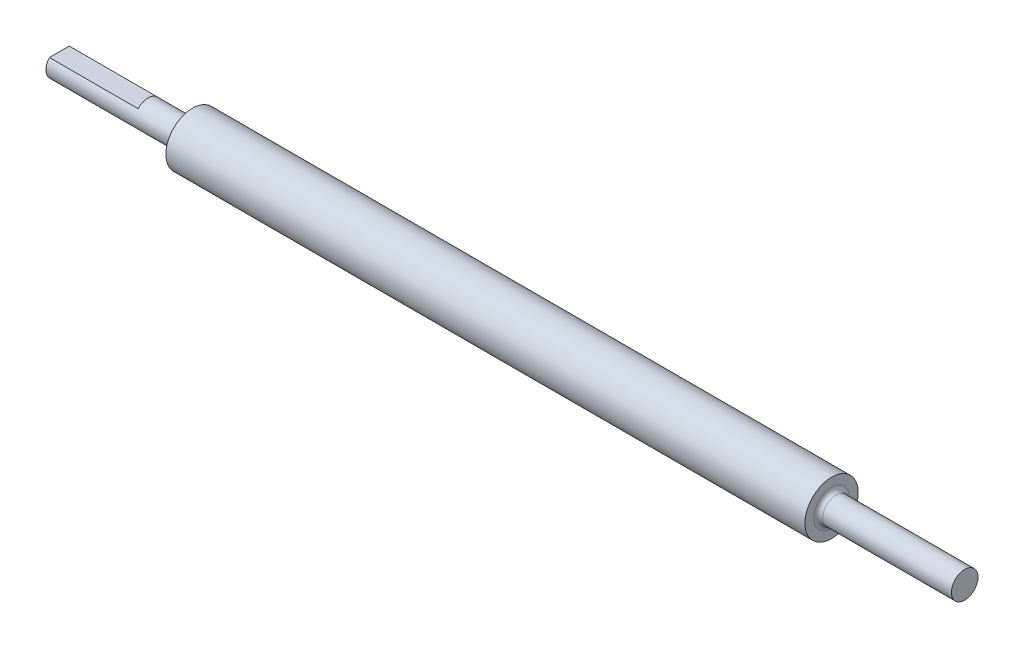
ISO-10303-21;
HEADER;
FILE_DESCRIPTION(('STEP AP214'),'2;1');
FILE_NAME('part.step','',(''),(''),'','','');
FILE_SCHEMA(('AUTOMOTIVE_DESIGN { 1 0 10303 214 1 1 1 1 }'));
ENDSEC;
DATA;
#1=APPLICATION_CONTEXT('core data for automotive mechanical design processes');
#2=APPLICATION_PROTOCOL_DEFINITION('international standard','automotive_design',2000,#1);
#3=PRODUCT_CONTEXT('',#1,'mechanical');
#4=PRODUCT('Part','Part','',(#3));
#5=PRODUCT_RELATED_PRODUCT_CATEGORY('part','',(#4));
#6=PRODUCT_DEFINITION_FORMATION('','',#4);
#7=PRODUCT_DEFINITION_CONTEXT('part definition',#1,'design');
#8=PRODUCT_DEFINITION('design','',#6,#7);
#9=PRODUCT_DEFINITION_SHAPE('','',#8);
#10=(LENGTH_UNIT() NAMED_UNIT(*) SI_UNIT(.MILLI.,.METRE.));
#11=(NAMED_UNIT(*) PLANE_ANGLE_UNIT() SI_UNIT($,.RADIAN.));
#12=(NAMED_UNIT(*) SI_UNIT($,.STERADIAN.) SOLID_ANGLE_UNIT());
#13=UNCERTAINTY_MEASURE_WITH_UNIT(LENGTH_MEASURE(1.E-05),#10,'distance_accuracy_value','');
#14=(GEOMETRIC_REPRESENTATION_CONTEXT(3) GLOBAL_UNCERTAINTY_ASSIGNED_CONTEXT((#13)) GLOBAL_UNIT_ASSIGNED_CONTEXT((#10,
#11,#12)) REPRESENTATION_CONTEXT('',''));
#15=CARTESIAN_POINT('',(0.,0.,0.));
#16=DIRECTION('',(0.,0.,1.));
#17=DIRECTION('',(1.,0.,0.));
#18=AXIS2_PLACEMENT_3D('',#15,#16,#17);
#19=CARTESIAN_POINT('',(-29.5589696751105,0.,16.4809347502352));
#20=DIRECTION('',(1.,0.,0.));
#21=DIRECTION('',(0.,0.,-1.));
#22=AXIS2_PLACEMENT_3D('',#19,#20,#21);
#23=PLANE('',#22);
#24=CARTESIAN_POINT('',(-29.5589696751105,0.,16.4809347502352));
#25=DIRECTION('',(-1.,0.,0.));
#26=DIRECTION('',(0.,0.,1.));
#27=AXIS2_PLACEMENT_3D('',#24,#25,#26);
#28=CIRCLE('',#27,1.5);
#29=CARTESIAN_POINT('',(-29.5589696751105,1.,15.3629007614853));
#30=VERTEX_POINT('',#29);
#31=CARTESIAN_POINT('',(-29.5589696751105,1.,17.5989687389851));
#32=VERTEX_POINT('',#31);
#33=EDGE_CURVE('E73',#30,#32,#28,.T.);
#34=ORIENTED_EDGE('',*,*,#33,.T.);
#35=DIRECTION('',(0.,0.,1.));
#36=VECTOR('',#35,1.);
#37=CARTESIAN_POINT('',(-29.5589696751105,1.,15.3629007614853));
#38=LINE('',#37,#36);
#39=EDGE_CURVE('E65',#30,#32,#38,.T.);
#40=ORIENTED_EDGE('',*,*,#39,.F.);
#41=EDGE_LOOP('',(#34,#40));
#42=FACE_BOUND('',#41,.T.);
#43=ADVANCED_FACE('F36',(#42),#23,.F.);
#44=CARTESIAN_POINT('',(-29.5589696751105,0.,16.4809347502352));
#45=DIRECTION('',(-1.,0.,0.));
#46=DIRECTION('',(0.,0.,1.));
#47=AXIS2_PLACEMENT_3D('',#44,#45,#46);
#48=CYLINDRICAL_SURFACE('',#47,1.5);
#49=CARTESIAN_POINT('',(-15.0589696751105,0.,16.4809347502352));
#50=DIRECTION('',(1.,0.,0.));
#51=DIRECTION('',(0.,0.,-1.));
#52=AXIS2_PLACEMENT_3D('',#49,#50,#51);
#53=CIRCLE('',#52,1.5);
#54=CARTESIAN_POINT('',(-15.0589696751105,0.,14.9809347502352));
#55=VERTEX_POINT('',#54);
#56=EDGE_CURVE('E76',#55,#55,#53,.F.);
#57=ORIENTED_EDGE('',*,*,#56,.T.);
#58=EDGE_LOOP('',(#57));
#59=FACE_BOUND('',#58,.T.);
#60=CARTESIAN_POINT('',(-19.5589696751105,0.,16.4809347502352));
#61=DIRECTION('',(-1.,0.,0.));
#62=DIRECTION('',(0.,0.,-1.));
#63=AXIS2_PLACEMENT_3D('',#60,#61,#62);
#64=CIRCLE('',#63,1.5);
#65=CARTESIAN_POINT('',(-19.5589696751105,1.,17.5989687389851));
#66=VERTEX_POINT('',#65);
#67=CARTESIAN_POINT('',(-19.5589696751105,1.,15.3629007614853));
#68=VERTEX_POINT('',#67);
#69=EDGE_CURVE('E55',#66,#68,#64,.T.);
#70=ORIENTED_EDGE('',*,*,#69,.F.);
#71=DIRECTION('',(-1.,0.,0.));
#72=VECTOR('',#71,1.);
#73=CARTESIAN_POINT('',(-19.5589696751105,1.,17.5989687389851));
#74=LINE('',#73,#72);
#75=EDGE_CURVE('E69',#66,#32,#74,.T.);
#76=ORIENTED_EDGE('',*,*,#75,.T.);
#77=ORIENTED_EDGE('',*,*,#33,.F.);
#78=DIRECTION('',(-1.,0.,0.));
#79=VECTOR('',#78,1.);
#80=CARTESIAN_POINT('',(-19.5589696751105,1.,15.3629007614853));
#81=LINE('',#80,#79);
#82=EDGE_CURVE('E62',#68,#30,#81,.T.);
#83=ORIENTED_EDGE('',*,*,#82,.F.);
#84=EDGE_LOOP('',(#70,#76,#77,#83));
#85=FACE_BOUND('',#84,.T.);
#86=ADVANCED_FACE('F75',(#59,#85),#48,.T.);
#87=CARTESIAN_POINT('',(-14.5589696751105,0.,13.4809347502352));
#88=DIRECTION('',(1.,0.,0.));
#89=DIRECTION('',(0.,0.,-1.));
#90=AXIS2_PLACEMENT_3D('',#87,#88,#89);
#91=PLANE('',#90);
#92=CARTESIAN_POINT('',(-14.5589696751105,0.,16.4809347502352));
#93=DIRECTION('',(1.,0.,0.));
#94=DIRECTION('',(0.,0.,-1.));
#95=AXIS2_PLACEMENT_3D('',#92,#93,#94);
#96=CIRCLE('',#95,2.);
#97=CARTESIAN_POINT('',(-14.5589696751105,0.,14.4809347502352));
#98=VERTEX_POINT('',#97);
#99=EDGE_CURVE('E80',#98,#98,#96,.T.);
#100=ORIENTED_EDGE('',*,*,#99,.T.);
#101=EDGE_LOOP('',(#100));
#102=FACE_BOUND('',#101,.T.);
#103=CARTESIAN_POINT('',(-14.5589696751105,0.,16.4809347502352));
#104=DIRECTION('',(-1.,0.,0.));
#105=DIRECTION('',(0.,0.,1.));
#106=AXIS2_PLACEMENT_3D('',#103,#104,#105);
#107=CIRCLE('',#106,3.);
#108=CARTESIAN_POINT('',(-14.5589696751105,0.,19.4809347502352));
#109=VERTEX_POINT('',#108);
#110=EDGE_CURVE('E77',#109,#109,#107,.T.);
#111=ORIENTED_EDGE('',*,*,#110,.T.);
#112=EDGE_LOOP('',(#111));
#113=FACE_BOUND('',#112,.T.);
#114=ADVANCED_FACE('F111',(#102,#113),#91,.F.);
#115=CARTESIAN_POINT('',(-29.5589696751105,0.,16.4809347502352));
#116=DIRECTION('',(-1.,0.,0.));
#117=DIRECTION('',(0.,0.,1.));
#118=AXIS2_PLACEMENT_3D('',#115,#116,#117);
#119=CYLINDRICAL_SURFACE('',#118,3.);
#120=ORIENTED_EDGE('',*,*,#110,.F.);
#121=EDGE_LOOP('',(#120));
#122=FACE_BOUND('',#121,.T.);
#123=CARTESIAN_POINT('',(57.4410303248895,0.,16.4809347502352));
#124=DIRECTION('',(-1.,0.,0.));
#125=DIRECTION('',(0.,0.,1.));
#126=AXIS2_PLACEMENT_3D('',#123,#124,#125);
#127=CIRCLE('',#126,3.);
#128=CARTESIAN_POINT('',(57.4410303248895,0.,19.4809347502352));
#129=VERTEX_POINT('',#128);
#130=EDGE_CURVE('E83',#129,#129,#127,.T.);
#131=ORIENTED_EDGE('',*,*,#130,.T.);
#132=EDGE_LOOP('',(#131));
#133=FACE_BOUND('',#132,.T.);
#134=ADVANCED_FACE('F117',(#122,#133),#119,.T.);
#135=CARTESIAN_POINT('',(57.4410303248895,0.,13.4809347502352));
#136=DIRECTION('',(-1.,0.,0.));
#137=DIRECTION('',(0.,0.,1.));
#138=AXIS2_PLACEMENT_3D('',#135,#136,#137);
#139=PLANE('',#138);
#140=CARTESIAN_POINT('',(57.4410303248895,0.,16.4809347502352));
#141=DIRECTION('',(-1.,0.,0.));
#142=DIRECTION('',(0.,0.,1.));
#143=AXIS2_PLACEMENT_3D('',#140,#141,#142);
#144=CIRCLE('',#143,2.);
#145=CARTESIAN_POINT('',(57.4410303248895,0.,18.4809347502352));
#146=VERTEX_POINT('',#145);
#147=EDGE_CURVE('E44',#146,#146,#144,.T.);
#148=ORIENTED_EDGE('',*,*,#147,.T.);
#149=EDGE_LOOP('',(#148));
#150=FACE_BOUND('',#149,.T.);
#151=ORIENTED_EDGE('',*,*,#130,.F.);
#152=EDGE_LOOP('',(#151));
#153=FACE_BOUND('',#152,.T.);
#154=ADVANCED_FACE('F91',(#150,#153),#139,.F.);
#155=CARTESIAN_POINT('',(-29.5589696751105,0.,16.4809347502352));
#156=DIRECTION('',(-1.,0.,0.));
#157=DIRECTION('',(0.,0.,1.));
#158=AXIS2_PLACEMENT_3D('',#155,#156,#157);
#159=CYLINDRICAL_SURFACE('',#158,1.5);
#160=CARTESIAN_POINT('',(57.9410303248895,0.,16.4809347502352));
#161=DIRECTION('',(-1.,0.,0.));
#162=DIRECTION('',(0.,0.,1.));
#163=AXIS2_PLACEMENT_3D('',#160,#161,#162);
#164=CIRCLE('',#163,1.5);
#165=CARTESIAN_POINT('',(57.9410303248895,0.,17.9809347502352));
#166=VERTEX_POINT('',#165);
#167=EDGE_CURVE('E11',#166,#166,#164,.F.);
#168=ORIENTED_EDGE('',*,*,#167,.T.);
#169=EDGE_LOOP('',(#168));
#170=FACE_BOUND('',#169,.T.);
#171=CARTESIAN_POINT('',(72.4410303248895,0.,16.4809347502352));
#172=DIRECTION('',(-1.,0.,0.));
#173=DIRECTION('',(0.,0.,1.));
#174=AXIS2_PLACEMENT_3D('',#171,#172,#173);
#175=CIRCLE('',#174,1.5);
#176=CARTESIAN_POINT('',(72.4410303248895,0.,17.9809347502352));
#177=VERTEX_POINT('',#176);
#178=EDGE_CURVE('E198',#177,#177,#175,.T.);
#179=ORIENTED_EDGE('',*,*,#178,.T.);
#180=EDGE_LOOP('',(#179));
#181=FACE_BOUND('',#180,.T.);
#182=ADVANCED_FACE('F124',(#170,#181),#159,.T.);
#183=CARTESIAN_POINT('',(72.4410303248895,0.,14.9809347502352));
#184=DIRECTION('',(-1.,0.,0.));
#185=DIRECTION('',(0.,0.,1.));
#186=AXIS2_PLACEMENT_3D('',#183,#184,#185);
#187=PLANE('',#186);
#188=ORIENTED_EDGE('',*,*,#178,.F.);
#189=EDGE_LOOP('',(#188));
#190=FACE_BOUND('',#189,.T.);
#191=ADVANCED_FACE('F103',(#190),#187,.F.);
#192=CARTESIAN_POINT('',(-15.0589696751105,0.,16.4809347502352));
#193=DIRECTION('',(1.,0.,0.));
#194=DIRECTION('',(0.,0.,-1.));
#195=AXIS2_PLACEMENT_3D('',#192,#193,#194);
#196=TOROIDAL_SURFACE('',#195,2.,0.5);
#197=ORIENTED_EDGE('',*,*,#99,.F.);
#198=EDGE_LOOP('',(#197));
#199=FACE_BOUND('',#198,.T.);
#200=ORIENTED_EDGE('',*,*,#56,.F.);
#201=EDGE_LOOP('',(#200));
#202=FACE_BOUND('',#201,.T.);
#203=ADVANCED_FACE('F95',(#199,#202),#196,.F.);
#204=CARTESIAN_POINT('',(57.9410303248895,0.,16.4809347502352));
#205=DIRECTION('',(-1.,0.,0.));
#206=DIRECTION('',(0.,0.,1.));
#207=AXIS2_PLACEMENT_3D('',#204,#205,#206);
#208=TOROIDAL_SURFACE('',#207,2.,0.5);
#209=ORIENTED_EDGE('',*,*,#167,.F.);
#210=EDGE_LOOP('',(#209));
#211=FACE_BOUND('',#210,.T.);
#212=ORIENTED_EDGE('',*,*,#147,.F.);
#213=EDGE_LOOP('',(#212));
#214=FACE_BOUND('',#213,.T.);
#215=ADVANCED_FACE('F38',(#211,#214),#208,.F.);
#216=CARTESIAN_POINT('',(-19.5589696751105,1.,15.3629007614853));
#217=DIRECTION('',(0.,-1.,0.));
#218=DIRECTION('',(0.,0.,-1.));
#219=AXIS2_PLACEMENT_3D('',#216,#217,#218);
#220=PLANE('',#219);
#221=ORIENTED_EDGE('',*,*,#39,.T.);
#222=ORIENTED_EDGE('',*,*,#75,.F.);
#223=DIRECTION('',(0.,0.,1.));
#224=VECTOR('',#223,1.);
#225=CARTESIAN_POINT('',(-19.5589696751105,1.,15.3629007614853));
#226=LINE('',#225,#224);
#227=EDGE_CURVE('E50',#68,#66,#226,.T.);
#228=ORIENTED_EDGE('',*,*,#227,.F.);
#229=ORIENTED_EDGE('',*,*,#82,.T.);
#230=EDGE_LOOP('',(#221,#222,#228,#229));
#231=FACE_BOUND('',#230,.T.);
#232=ADVANCED_FACE('F64',(#231),#220,.F.);
#233=CARTESIAN_POINT('',(-19.5589696751105,0.,16.4809347502352));
#234=DIRECTION('',(1.,0.,0.));
#235=DIRECTION('',(0.,0.,-1.));
#236=AXIS2_PLACEMENT_3D('',#233,#234,#235);
#237=PLANE('',#236);
#238=ORIENTED_EDGE('',*,*,#69,.T.);
#239=ORIENTED_EDGE('',*,*,#227,.T.);
#240=EDGE_LOOP('',(#238,#239));
#241=FACE_BOUND('',#240,.T.);
#242=ADVANCED_FACE('F101',(#241),#237,.F.);
#243=CLOSED_SHELL('',(#43,#86,#114,#134,#154,#182,#191,#203,#215,#232,#242));
#244=MANIFOLD_SOLID_BREP('B2',#243);
#245=ADVANCED_BREP_SHAPE_REPRESENTATION('',(#18,#244),#14);
#246=SHAPE_DEFINITION_REPRESENTATION(#9,#245);
ENDSEC;
END-ISO-10303-21;
